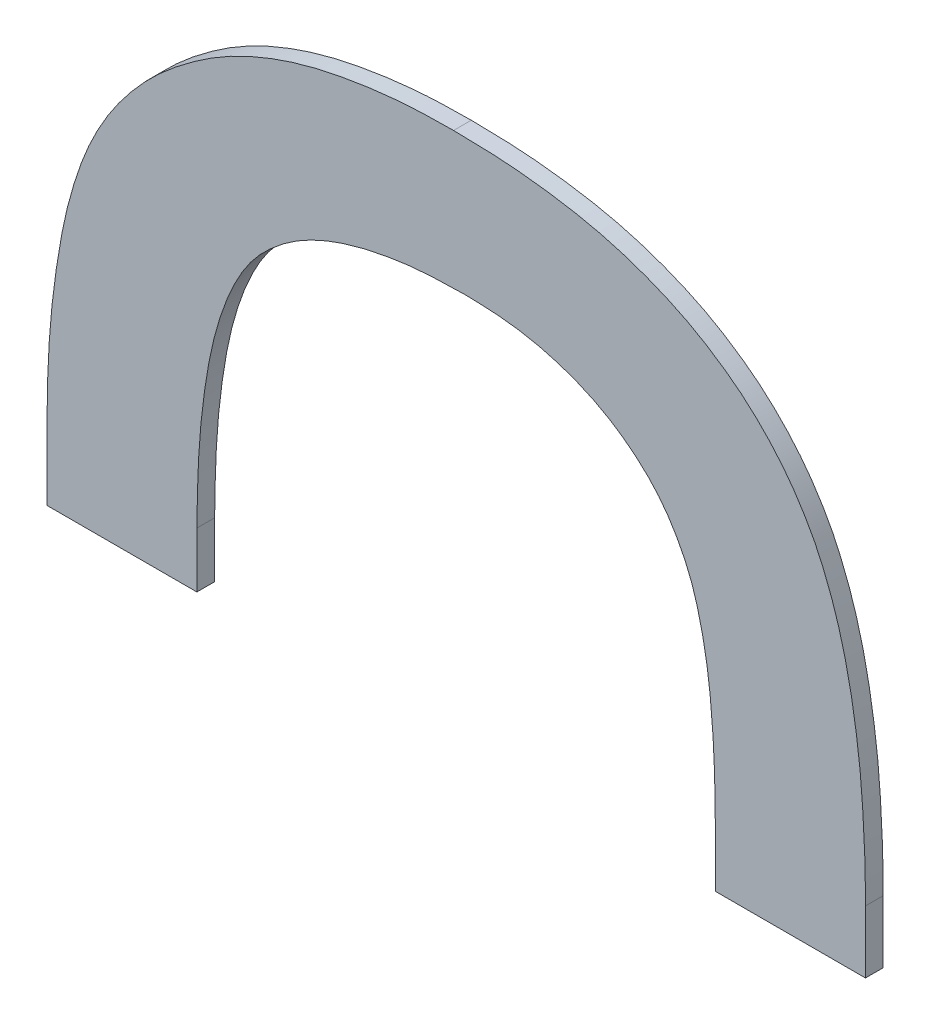
ISO-10303-21;
HEADER;
FILE_DESCRIPTION(('STEP AP214'),'2;1');
FILE_NAME('part.step','',(''),(''),'','','');
FILE_SCHEMA(('AUTOMOTIVE_DESIGN { 1 0 10303 214 1 1 1 1 }'));
ENDSEC;
DATA;
#1=APPLICATION_CONTEXT('core data for automotive mechanical design processes');
#2=APPLICATION_PROTOCOL_DEFINITION('international standard','automotive_design',2000,#1);
#3=PRODUCT_CONTEXT('',#1,'mechanical');
#4=PRODUCT('Part','Part','',(#3));
#5=PRODUCT_RELATED_PRODUCT_CATEGORY('part','',(#4));
#6=PRODUCT_DEFINITION_FORMATION('','',#4);
#7=PRODUCT_DEFINITION_CONTEXT('part definition',#1,'design');
#8=PRODUCT_DEFINITION('design','',#6,#7);
#9=PRODUCT_DEFINITION_SHAPE('','',#8);
#10=(LENGTH_UNIT() NAMED_UNIT(*) SI_UNIT(.MILLI.,.METRE.));
#11=(NAMED_UNIT(*) PLANE_ANGLE_UNIT() SI_UNIT($,.RADIAN.));
#12=(NAMED_UNIT(*) SI_UNIT($,.STERADIAN.) SOLID_ANGLE_UNIT());
#13=UNCERTAINTY_MEASURE_WITH_UNIT(LENGTH_MEASURE(1.E-05),#10,'distance_accuracy_value','');
#14=(GEOMETRIC_REPRESENTATION_CONTEXT(3) GLOBAL_UNCERTAINTY_ASSIGNED_CONTEXT((#13)) GLOBAL_UNIT_ASSIGNED_CONTEXT((#10,
#11,#12)) REPRESENTATION_CONTEXT('',''));
#15=CARTESIAN_POINT('',(0.,0.,0.));
#16=DIRECTION('',(0.,0.,1.));
#17=DIRECTION('',(1.,0.,0.));
#18=AXIS2_PLACEMENT_3D('',#15,#16,#17);
#19=CARTESIAN_POINT('',(-7.30769230769231,2.06129807692308,0.5));
#20=DIRECTION('',(-1.,0.,0.));
#21=DIRECTION('',(0.,0.,1.));
#22=AXIS2_PLACEMENT_3D('',#19,#20,#21);
#23=PLANE('',#22);
#24=DIRECTION('',(0.,-1.,0.));
#25=VECTOR('',#24,1.);
#26=CARTESIAN_POINT('',(-7.30769230769231,2.06129807692308,1.));
#27=LINE('',#26,#25);
#28=CARTESIAN_POINT('',(-7.30769230769231,2.06129807692308,1.));
#29=VERTEX_POINT('',#28);
#30=CARTESIAN_POINT('',(-7.30769230769231,0.5,1.));
#31=VERTEX_POINT('',#30);
#32=EDGE_CURVE('E239',#29,#31,#27,.T.);
#33=ORIENTED_EDGE('',*,*,#32,.T.);
#34=DIRECTION('',(0.,0.,-1.));
#35=VECTOR('',#34,1.);
#36=CARTESIAN_POINT('',(-7.30769230769231,0.5,0.5));
#37=LINE('',#36,#35);
#38=CARTESIAN_POINT('',(-7.30769230769231,0.5,0.500000000000067));
#39=VERTEX_POINT('',#38);
#40=EDGE_CURVE('E74',#31,#39,#37,.T.);
#41=ORIENTED_EDGE('',*,*,#40,.T.);
#42=DIRECTION('',(0.,-1.,0.));
#43=VECTOR('',#42,1.);
#44=CARTESIAN_POINT('',(-7.30769230769231,2.06129807692308,0.5));
#45=LINE('',#44,#43);
#46=CARTESIAN_POINT('',(-7.30769230769231,2.06129807692308,0.5));
#47=VERTEX_POINT('',#46);
#48=EDGE_CURVE('E186',#47,#39,#45,.T.);
#49=ORIENTED_EDGE('',*,*,#48,.F.);
#50=DIRECTION('',(0.,0.,1.));
#51=VECTOR('',#50,1.);
#52=CARTESIAN_POINT('',(-7.30769230769231,2.06129807692308,0.5));
#53=LINE('',#52,#51);
#54=EDGE_CURVE('E215',#47,#29,#53,.T.);
#55=ORIENTED_EDGE('',*,*,#54,.T.);
#56=EDGE_LOOP('',(#33,#41,#49,#55));
#57=FACE_BOUND('',#56,.T.);
#58=ADVANCED_FACE('F39',(#57),#23,.F.);
#59=CARTESIAN_POINT('',(-11.5384615384615,-15.,0.5));
#60=DIRECTION('',(1.,0.,0.));
#61=DIRECTION('',(0.,0.,-1.));
#62=AXIS2_PLACEMENT_3D('',#59,#60,#61);
#63=PLANE('',#62);
#64=DIRECTION('',(0.,1.,0.));
#65=VECTOR('',#64,1.);
#66=CARTESIAN_POINT('',(-11.5384615384615,-15.,0.5));
#67=LINE('',#66,#65);
#68=CARTESIAN_POINT('',(-11.5384615384615,0.5,0.5));
#69=VERTEX_POINT('',#68);
#70=CARTESIAN_POINT('',(-11.5384615384615,2.25961538461538,0.5));
#71=VERTEX_POINT('',#70);
#72=EDGE_CURVE('E118',#69,#71,#67,.T.);
#73=ORIENTED_EDGE('',*,*,#72,.F.);
#74=DIRECTION('',(0.,0.,1.));
#75=VECTOR('',#74,1.);
#76=CARTESIAN_POINT('',(-11.5384615384615,0.5,0.5));
#77=LINE('',#76,#75);
#78=CARTESIAN_POINT('',(-11.5384615384615,0.5,1.));
#79=VERTEX_POINT('',#78);
#80=EDGE_CURVE('E79',#69,#79,#77,.T.);
#81=ORIENTED_EDGE('',*,*,#80,.T.);
#82=DIRECTION('',(0.,1.,0.));
#83=VECTOR('',#82,1.);
#84=CARTESIAN_POINT('',(-11.5384615384615,-15.,1.));
#85=LINE('',#84,#83);
#86=CARTESIAN_POINT('',(-11.5384615384615,2.25961538461538,1.));
#87=VERTEX_POINT('',#86);
#88=EDGE_CURVE('E132',#79,#87,#85,.T.);
#89=ORIENTED_EDGE('',*,*,#88,.T.);
#90=DIRECTION('',(0.,0.,1.));
#91=VECTOR('',#90,1.);
#92=CARTESIAN_POINT('',(-11.5384615384615,2.25961538461538,0.5));
#93=LINE('',#92,#91);
#94=EDGE_CURVE('E131',#71,#87,#93,.T.);
#95=ORIENTED_EDGE('',*,*,#94,.F.);
#96=EDGE_LOOP('',(#73,#81,#89,#95));
#97=FACE_BOUND('',#96,.T.);
#98=ADVANCED_FACE('F135',(#97),#63,.F.);
#99=CARTESIAN_POINT('',(11.5384615384615,2.25961538461538,0.5));
#100=DIRECTION('',(-1.,0.,0.));
#101=DIRECTION('',(0.,0.,1.));
#102=AXIS2_PLACEMENT_3D('',#99,#100,#101);
#103=PLANE('',#102);
#104=DIRECTION('',(0.,-1.,0.));
#105=VECTOR('',#104,1.);
#106=CARTESIAN_POINT('',(11.5384615384615,2.25961538461538,1.));
#107=LINE('',#106,#105);
#108=CARTESIAN_POINT('',(11.5384615384615,2.25961538461538,1.));
#109=VERTEX_POINT('',#108);
#110=CARTESIAN_POINT('',(11.5384615384615,0.5,1.));
#111=VERTEX_POINT('',#110);
#112=EDGE_CURVE('E231',#109,#111,#107,.T.);
#113=ORIENTED_EDGE('',*,*,#112,.T.);
#114=DIRECTION('',(0.,0.,-1.));
#115=VECTOR('',#114,1.);
#116=CARTESIAN_POINT('',(11.5384615384615,0.5,0.5));
#117=LINE('',#116,#115);
#118=CARTESIAN_POINT('',(11.5384615384615,0.5,0.500000000000646));
#119=VERTEX_POINT('',#118);
#120=EDGE_CURVE('E59',#111,#119,#117,.T.);
#121=ORIENTED_EDGE('',*,*,#120,.T.);
#122=DIRECTION('',(0.,-1.,0.));
#123=VECTOR('',#122,1.);
#124=CARTESIAN_POINT('',(11.5384615384615,2.25961538461538,0.5));
#125=LINE('',#124,#123);
#126=CARTESIAN_POINT('',(11.5384615384615,2.25961538461538,0.5));
#127=VERTEX_POINT('',#126);
#128=EDGE_CURVE('E238',#127,#119,#125,.T.);
#129=ORIENTED_EDGE('',*,*,#128,.F.);
#130=DIRECTION('',(0.,0.,1.));
#131=VECTOR('',#130,1.);
#132=CARTESIAN_POINT('',(11.5384615384615,2.25961538461538,0.5));
#133=LINE('',#132,#131);
#134=EDGE_CURVE('E225',#127,#109,#133,.T.);
#135=ORIENTED_EDGE('',*,*,#134,.T.);
#136=EDGE_LOOP('',(#113,#121,#129,#135));
#137=FACE_BOUND('',#136,.T.);
#138=ADVANCED_FACE('F278',(#137),#103,.F.);
#139=CARTESIAN_POINT('',(7.3076923076923,-15.,0.5));
#140=DIRECTION('',(1.,0.,0.));
#141=DIRECTION('',(0.,0.,-1.));
#142=AXIS2_PLACEMENT_3D('',#139,#140,#141);
#143=PLANE('',#142);
#144=DIRECTION('',(0.,1.,0.));
#145=VECTOR('',#144,1.);
#146=CARTESIAN_POINT('',(7.3076923076923,-15.,0.5));
#147=LINE('',#146,#145);
#148=CARTESIAN_POINT('',(7.3076923076923,0.5,0.5));
#149=VERTEX_POINT('',#148);
#150=CARTESIAN_POINT('',(7.3076923076923,2.06129807692308,0.5));
#151=VERTEX_POINT('',#150);
#152=EDGE_CURVE('E43',#149,#151,#147,.T.);
#153=ORIENTED_EDGE('',*,*,#152,.F.);
#154=DIRECTION('',(0.,0.,1.));
#155=VECTOR('',#154,1.);
#156=CARTESIAN_POINT('',(7.3076923076923,0.5,0.5));
#157=LINE('',#156,#155);
#158=CARTESIAN_POINT('',(7.3076923076923,0.5,1.));
#159=VERTEX_POINT('',#158);
#160=EDGE_CURVE('E224',#149,#159,#157,.T.);
#161=ORIENTED_EDGE('',*,*,#160,.T.);
#162=DIRECTION('',(0.,1.,0.));
#163=VECTOR('',#162,1.);
#164=CARTESIAN_POINT('',(7.3076923076923,-15.,1.));
#165=LINE('',#164,#163);
#166=CARTESIAN_POINT('',(7.3076923076923,2.06129807692308,1.));
#167=VERTEX_POINT('',#166);
#168=EDGE_CURVE('E236',#159,#167,#165,.T.);
#169=ORIENTED_EDGE('',*,*,#168,.T.);
#170=DIRECTION('',(0.,0.,1.));
#171=VECTOR('',#170,1.);
#172=CARTESIAN_POINT('',(7.3076923076923,2.06129807692308,0.5));
#173=LINE('',#172,#171);
#174=EDGE_CURVE('E209',#151,#167,#173,.T.);
#175=ORIENTED_EDGE('',*,*,#174,.F.);
#176=EDGE_LOOP('',(#153,#161,#169,#175));
#177=FACE_BOUND('',#176,.T.);
#178=ADVANCED_FACE('F260',(#177),#143,.F.);
#179=CARTESIAN_POINT('',(-9.1279945813475,11.8227943515889,0.5));
#180=DIRECTION('',(0.,0.,1.));
#181=DIRECTION('',(1.,0.,0.));
#182=AXIS2_PLACEMENT_3D('',#179,#180,#181);
#183=PLANE('',#182);
#184=ORIENTED_EDGE('',*,*,#128,.T.);
#185=DIRECTION('',(-1.,0.,0.));
#186=VECTOR('',#185,1.);
#187=CARTESIAN_POINT('',(-9.1279945813475,0.5,0.500000000000011));
#188=LINE('',#187,#186);
#189=EDGE_CURVE('E242',#119,#149,#188,.T.);
#190=ORIENTED_EDGE('',*,*,#189,.T.);
#191=ORIENTED_EDGE('',*,*,#152,.T.);
#192=CARTESIAN_POINT('',(7.3076923076923,2.06129807692308,0.5));
#193=CARTESIAN_POINT('',(7.30492464339925,2.37180951393219,0.5));
#194=CARTESIAN_POINT('',(7.29958439432423,2.97094591152046,0.5));
#195=CARTESIAN_POINT('',(7.27179811611518,3.83886988209014,0.5));
#196=CARTESIAN_POINT('',(7.21599643148024,4.64427080773635,0.5));
#197=CARTESIAN_POINT('',(7.14786609444757,5.38652355137483,0.5));
#198=CARTESIAN_POINT('',(7.05207843159399,6.06454337816855,0.5));
#199=CARTESIAN_POINT('',(6.93166836438434,6.67792351238892,0.5));
#200=CARTESIAN_POINT('',(6.79559411421944,7.23021580945742,0.5));
#201=CARTESIAN_POINT('',(6.59269758736639,7.87663769488416,0.5));
#202=CARTESIAN_POINT('',(6.2509578197552,8.59540790723907,0.5));
#203=CARTESIAN_POINT('',(5.73334589638995,9.37134422120032,0.5));
#204=CARTESIAN_POINT('',(5.06978727576096,10.0229214121841,0.5));
#205=CARTESIAN_POINT('',(4.30096133975564,10.5755701458769,0.5));
#206=CARTESIAN_POINT('',(3.42239283444398,11.0065956953157,0.5));
#207=CARTESIAN_POINT('',(2.44954968934613,11.3203474222732,0.5));
#208=CARTESIAN_POINT('',(1.3834294379006,11.5082326315945,0.5));
#209=CARTESIAN_POINT('',(0.641806032218003,11.5281598729243,0.5));
#210=CARTESIAN_POINT('',(0.258413461538454,11.5384615384615,0.5));
#211=B_SPLINE_CURVE_WITH_KNOTS('',3,(#192,#193,#194,#195,#196,#197,#198,#199,#200,#201,#202,
#203,#204,#205,#206,#207,#208,#209,#210),.UNSPECIFIED.,.F.,.F.,(4,1,1,1,1,1,1,1,1,1,1,1,1,1,1,1,
4),(0.,0.0681523875531097,0.131501036995337,0.190547702737169,0.245319763923776,
0.295061187567315,0.34076006309936,0.382453291313559,0.419855092081938,0.489284591891173,
0.556354865851981,0.623505787770759,0.692196357088421,0.763373155892575,0.837340007597801,
0.915910646622061,1.),.UNSPECIFIED.);
#212=CARTESIAN_POINT('',(0.258413461538454,11.5384615384615,0.5));
#213=VERTEX_POINT('',#212);
#214=EDGE_CURVE('E174',#151,#213,#211,.T.);
#215=ORIENTED_EDGE('',*,*,#214,.T.);
#216=CARTESIAN_POINT('',(0.258413461538454,11.5384615384615,0.5));
#217=CARTESIAN_POINT('',(-0.0702853549810801,11.5328710973775,0.5));
#218=CARTESIAN_POINT('',(-0.70496950329935,11.5220765214318,0.5));
#219=CARTESIAN_POINT('',(-1.62014451690163,11.434868408113,0.5));
#220=CARTESIAN_POINT('',(-2.45921785336281,11.2762568330178,0.5));
#221=CARTESIAN_POINT('',(-3.23061160376175,11.0702542734783,0.5));
#222=CARTESIAN_POINT('',(-3.9281032248337,10.7940283020894,0.5));
#223=CARTESIAN_POINT('',(-4.55670215304996,10.4595153882128,0.5));
#224=CARTESIAN_POINT('',(-5.09978346750444,10.0484527528207,0.5));
#225=CARTESIAN_POINT('',(-5.59117335237757,9.58702031593561,0.5));
#226=CARTESIAN_POINT('',(-6.00613112071804,9.02529527782142,0.5));
#227=CARTESIAN_POINT('',(-6.35288702731768,8.35774571413977,0.5));
#228=CARTESIAN_POINT('',(-6.65193442729842,7.58382060950632,0.5));
#229=CARTESIAN_POINT('',(-6.89682858419583,6.69616380722172,0.5));
#230=CARTESIAN_POINT('',(-7.07567007960251,5.69370283232904,0.5));
#231=CARTESIAN_POINT('',(-7.2153850201337,4.58270417195884,0.5));
#232=CARTESIAN_POINT('',(-7.28866601234068,3.35834252049965,0.5));
#233=CARTESIAN_POINT('',(-7.30116763858732,2.50609227634031,0.5));
#234=CARTESIAN_POINT('',(-7.30769230769231,2.06129807692308,0.5));
#235=B_SPLINE_CURVE_WITH_KNOTS('',3,(#216,#217,#218,#219,#220,#221,#222,#223,#224,#225,#226,
#227,#228,#229,#230,#231,#232,#233,#234),.UNSPECIFIED.,.F.,.F.,(4,1,1,1,1,1,1,1,1,1,1,1,1,1,1,1,
4),(0.,0.0694744696082631,0.134148169561674,0.194025450312316,0.249805570083777,
0.302644235940443,0.352286550022306,0.39979548148293,0.446212546524587,0.494314049923034,
0.546594986641963,0.604782077121389,0.669401695688407,0.740905897606556,0.819843157026125,
0.90597512961801,1.),.UNSPECIFIED.);
#236=EDGE_CURVE('E178',#213,#47,#235,.T.);
#237=ORIENTED_EDGE('',*,*,#236,.T.);
#238=ORIENTED_EDGE('',*,*,#48,.T.);
#239=EDGE_CURVE('E77',#39,#69,#188,.T.);
#240=ORIENTED_EDGE('',*,*,#239,.T.);
#241=ORIENTED_EDGE('',*,*,#72,.T.);
#242=CARTESIAN_POINT('',(-11.5384615384615,2.25961538461538,0.5));
#243=CARTESIAN_POINT('',(-11.5340612526563,2.6262309134687,0.5));
#244=CARTESIAN_POINT('',(-11.5254982892703,3.33966533323989,0.5));
#245=CARTESIAN_POINT('',(-11.4863268967097,4.38016034794047,0.5));
#246=CARTESIAN_POINT('',(-11.4092879584686,5.36272296458241,0.5));
#247=CARTESIAN_POINT('',(-11.2939236254168,6.28432928941146,0.5));
#248=CARTESIAN_POINT('',(-11.1560519585036,7.15068568459334,0.5));
#249=CARTESIAN_POINT('',(-10.9931716516817,7.95886617242391,0.5));
#250=CARTESIAN_POINT('',(-10.7856103519112,8.70815010365485,0.5));
#251=CARTESIAN_POINT('',(-10.552633586817,9.40676242289213,0.5));
#252=CARTESIAN_POINT('',(-10.2752052785402,10.0608586839567,0.5));
#253=CARTESIAN_POINT('',(-9.94714250776757,10.6798210539499,0.5));
#254=CARTESIAN_POINT('',(-9.57009976714921,11.2675364183271,0.5));
#255=CARTESIAN_POINT('',(-9.13982636990601,11.8227112319163,0.5));
#256=CARTESIAN_POINT('',(-8.66316070509604,12.3487173012148,0.5));
#257=CARTESIAN_POINT('',(-8.13449329563663,12.841393988725,0.5));
#258=CARTESIAN_POINT('',(-7.55145160462416,13.2973326288733,0.5));
#259=CARTESIAN_POINT('',(-6.92881865788958,13.7337693981739,0.5));
#260=CARTESIAN_POINT('',(-6.25019786991767,14.1240786478193,0.5));
#261=CARTESIAN_POINT('',(-5.5170829891336,14.4607431999846,0.5));
#262=CARTESIAN_POINT('',(-4.73417797151823,14.750325096289,0.5));
#263=CARTESIAN_POINT('',(-3.89767072007156,14.9831310596466,0.5));
#264=CARTESIAN_POINT('',(-3.01140022661227,15.1610472772252,0.5));
#265=CARTESIAN_POINT('',(-2.07665015904746,15.2940835399966,0.5));
#266=CARTESIAN_POINT('',(-1.09110898318668,15.3727217749308,0.5));
#267=CARTESIAN_POINT('',(-0.416810076717399,15.3805921364478,0.5));
#268=CARTESIAN_POINT('',(-0.0721153846153927,15.3846153846154,0.5));
#269=B_SPLINE_CURVE_WITH_KNOTS('',3,(#242,#243,#244,#245,#246,#247,#248,#249,#250,#251,#252,
#253,#254,#255,#256,#257,#258,#259,#260,#261,#262,#263,#264,#265,#266,#267,#268),.UNSPECIFIED.,
.F.,.F.,(4,1,1,1,1,1,1,1,1,1,1,1,1,1,1,1,1,1,1,1,1,1,1,1,4),(0.,0.0546407144744631,
0.106330919884652,0.155147953952163,0.201472174088549,0.244712501219021,0.285873562670016,
0.324259277154986,0.360512285011698,0.395557726801311,0.4300132653778,0.464794488861085,
0.499488476916475,0.534572046124569,0.570481696802378,0.60703584911766,0.644798886777896,
0.683717265264563,0.723522131295569,0.764893775301427,0.807993711388816,0.852784120674043,
0.899522077845962,0.948636715694403,1.),.UNSPECIFIED.);
#270=CARTESIAN_POINT('',(-0.0721153846153927,15.3846153846154,0.5));
#271=VERTEX_POINT('',#270);
#272=EDGE_CURVE('E124',#71,#271,#269,.T.);
#273=ORIENTED_EDGE('',*,*,#272,.T.);
#274=CARTESIAN_POINT('',(-0.0721153846153927,15.3846153846154,0.5));
#275=CARTESIAN_POINT('',(0.264518715414854,15.3796616598468,0.5));
#276=CARTESIAN_POINT('',(0.920423994624566,15.3700097136324,0.5));
#277=CARTESIAN_POINT('',(1.88158746322403,15.304702510971,0.5));
#278=CARTESIAN_POINT('',(2.79589537908769,15.1890826610173,0.5));
#279=CARTESIAN_POINT('',(3.66596857120517,15.0369883310616,0.5));
#280=CARTESIAN_POINT('',(4.48752186728969,14.8325913341433,0.5));
#281=CARTESIAN_POINT('',(5.25957362054852,14.5782851361573,0.5));
#282=CARTESIAN_POINT('',(5.98715491057017,14.2849682150574,0.5));
#283=CARTESIAN_POINT('',(6.67114975176588,13.9500760195656,0.5));
#284=CARTESIAN_POINT('',(7.30134818837077,13.5604418430828,0.5));
#285=CARTESIAN_POINT('',(7.89398727333909,13.1443205046601,0.5));
#286=CARTESIAN_POINT('',(8.43153559786857,12.6754130025017,0.5));
#287=CARTESIAN_POINT('',(8.92434289384963,12.1713846235726,0.5));
#288=CARTESIAN_POINT('',(9.37314508634097,11.6280927132947,0.5));
#289=CARTESIAN_POINT('',(9.76914848452326,11.0403560048676,0.5));
#290=CARTESIAN_POINT('',(10.1276992503906,10.4166035828515,0.5));
#291=CARTESIAN_POINT('',(10.4252910925288,9.74071549769036,0.5));
#292=CARTESIAN_POINT('',(10.6939683405418,9.01932401356209,0.5));
#293=CARTESIAN_POINT('',(10.9191440367199,8.23726023656803,0.5));
#294=CARTESIAN_POINT('',(11.1114156809584,7.39452327675616,0.5));
#295=CARTESIAN_POINT('',(11.2643522580033,6.48916731646381,0.5));
#296=CARTESIAN_POINT('',(11.3941368723213,5.52154491453743,0.5));
#297=CARTESIAN_POINT('',(11.4714173329536,4.48812954314935,0.5));
#298=CARTESIAN_POINT('',(11.5294909767043,3.39408832000542,0.5));
#299=CARTESIAN_POINT('',(11.5354195967522,2.6443182197005,0.5));
#300=CARTESIAN_POINT('',(11.5384615384615,2.25961538461538,0.5));
#301=B_SPLINE_CURVE_WITH_KNOTS('',3,(#274,#275,#276,#277,#278,#279,#280,#281,#282,#283,#284,
#285,#286,#287,#288,#289,#290,#291,#292,#293,#294,#295,#296,#297,#298,#299,#300),.UNSPECIFIED.,
.F.,.F.,(4,1,1,1,1,1,1,1,1,1,1,1,1,1,1,1,1,1,1,1,1,1,1,1,4),(0.,0.0497116207271324,
0.0968592144113372,0.142173574931603,0.185751389824472,0.227220904620069,0.267071972318326,
0.305689623622102,0.342996802804478,0.379372877500813,0.414999075056876,0.449812797537921,
0.484538431658974,0.519006067109921,0.553712796066273,0.589083852803694,0.625097269819054,
0.662628953579155,0.702694640878255,0.745177332626792,0.790211777884763,0.838242017597077,
0.88929109798676,0.943195883036236,1.),.UNSPECIFIED.);
#302=EDGE_CURVE('E143',#271,#127,#301,.T.);
#303=ORIENTED_EDGE('',*,*,#302,.T.);
#304=EDGE_LOOP('',(#184,#190,#191,#215,#237,#238,#240,#241,#273,#303));
#305=FACE_BOUND('',#304,.T.);
#306=ADVANCED_FACE('F121',(#305),#183,.F.);
#307=CARTESIAN_POINT('',(-9.1279945813475,11.8227943515889,1.));
#308=DIRECTION('',(0.,0.,1.));
#309=DIRECTION('',(1.,0.,0.));
#310=AXIS2_PLACEMENT_3D('',#307,#308,#309);
#311=PLANE('',#310);
#312=ORIENTED_EDGE('',*,*,#88,.F.);
#313=DIRECTION('',(1.,0.,0.));
#314=VECTOR('',#313,1.);
#315=CARTESIAN_POINT('',(-17.,0.5,1.));
#316=LINE('',#315,#314);
#317=EDGE_CURVE('E147',#79,#31,#316,.T.);
#318=ORIENTED_EDGE('',*,*,#317,.T.);
#319=ORIENTED_EDGE('',*,*,#32,.F.);
#320=CARTESIAN_POINT('',(0.258413461538454,11.5384615384615,1.));
#321=CARTESIAN_POINT('',(-0.0702853549810801,11.5328710973775,1.));
#322=CARTESIAN_POINT('',(-0.70496950329935,11.5220765214318,1.));
#323=CARTESIAN_POINT('',(-1.62014451690163,11.434868408113,1.));
#324=CARTESIAN_POINT('',(-2.45921785336281,11.2762568330178,1.));
#325=CARTESIAN_POINT('',(-3.23061160376175,11.0702542734783,1.));
#326=CARTESIAN_POINT('',(-3.9281032248337,10.7940283020894,1.));
#327=CARTESIAN_POINT('',(-4.55670215304996,10.4595153882128,1.));
#328=CARTESIAN_POINT('',(-5.09978346750444,10.0484527528207,1.));
#329=CARTESIAN_POINT('',(-5.59117335237757,9.58702031593561,1.));
#330=CARTESIAN_POINT('',(-6.00613112071804,9.02529527782142,1.));
#331=CARTESIAN_POINT('',(-6.35288702731768,8.35774571413977,1.));
#332=CARTESIAN_POINT('',(-6.65193442729842,7.58382060950632,1.));
#333=CARTESIAN_POINT('',(-6.89682858419583,6.69616380722172,1.));
#334=CARTESIAN_POINT('',(-7.07567007960251,5.69370283232904,1.));
#335=CARTESIAN_POINT('',(-7.2153850201337,4.58270417195884,1.));
#336=CARTESIAN_POINT('',(-7.28866601234068,3.35834252049965,1.));
#337=CARTESIAN_POINT('',(-7.30116763858732,2.50609227634031,1.));
#338=CARTESIAN_POINT('',(-7.30769230769231,2.06129807692308,1.));
#339=B_SPLINE_CURVE_WITH_KNOTS('',3,(#320,#321,#322,#323,#324,#325,#326,#327,#328,#329,#330,
#331,#332,#333,#334,#335,#336,#337,#338),.UNSPECIFIED.,.F.,.F.,(4,1,1,1,1,1,1,1,1,1,1,1,1,1,1,1,
4),(0.,0.0694744696082631,0.134148169561674,0.194025450312316,0.249805570083777,
0.302644235940443,0.352286550022306,0.39979548148293,0.446212546524587,0.494314049923034,
0.546594986641963,0.604782077121389,0.669401695688407,0.740905897606556,0.819843157026125,
0.90597512961801,1.),.UNSPECIFIED.);
#340=CARTESIAN_POINT('',(0.258413461538454,11.5384615384615,1.));
#341=VERTEX_POINT('',#340);
#342=EDGE_CURVE('E47',#341,#29,#339,.T.);
#343=ORIENTED_EDGE('',*,*,#342,.F.);
#344=CARTESIAN_POINT('',(7.3076923076923,2.06129807692308,1.));
#345=CARTESIAN_POINT('',(7.30492464339925,2.37180951393219,1.));
#346=CARTESIAN_POINT('',(7.29958439432423,2.97094591152046,1.));
#347=CARTESIAN_POINT('',(7.27179811611518,3.83886988209014,1.));
#348=CARTESIAN_POINT('',(7.21599643148024,4.64427080773635,1.));
#349=CARTESIAN_POINT('',(7.14786609444757,5.38652355137483,1.));
#350=CARTESIAN_POINT('',(7.05207843159399,6.06454337816855,1.));
#351=CARTESIAN_POINT('',(6.93166836438434,6.67792351238892,1.));
#352=CARTESIAN_POINT('',(6.79559411421944,7.23021580945742,1.));
#353=CARTESIAN_POINT('',(6.59269758736639,7.87663769488416,1.));
#354=CARTESIAN_POINT('',(6.2509578197552,8.59540790723907,1.));
#355=CARTESIAN_POINT('',(5.73334589638995,9.37134422120032,1.));
#356=CARTESIAN_POINT('',(5.06978727576096,10.0229214121841,1.));
#357=CARTESIAN_POINT('',(4.30096133975564,10.5755701458769,1.));
#358=CARTESIAN_POINT('',(3.42239283444398,11.0065956953157,1.));
#359=CARTESIAN_POINT('',(2.44954968934613,11.3203474222732,1.));
#360=CARTESIAN_POINT('',(1.3834294379006,11.5082326315945,1.));
#361=CARTESIAN_POINT('',(0.641806032218003,11.5281598729243,1.));
#362=CARTESIAN_POINT('',(0.258413461538454,11.5384615384615,1.));
#363=B_SPLINE_CURVE_WITH_KNOTS('',3,(#344,#345,#346,#347,#348,#349,#350,#351,#352,#353,#354,
#355,#356,#357,#358,#359,#360,#361,#362),.UNSPECIFIED.,.F.,.F.,(4,1,1,1,1,1,1,1,1,1,1,1,1,1,1,1,
4),(0.,0.0681523875531097,0.131501036995337,0.190547702737169,0.245319763923776,
0.295061187567315,0.34076006309936,0.382453291313559,0.419855092081938,0.489284591891173,
0.556354865851981,0.623505787770759,0.692196357088421,0.763373155892575,0.837340007597801,
0.915910646622061,1.),.UNSPECIFIED.);
#364=EDGE_CURVE('E198',#167,#341,#363,.T.);
#365=ORIENTED_EDGE('',*,*,#364,.F.);
#366=ORIENTED_EDGE('',*,*,#168,.F.);
#367=EDGE_CURVE('E194',#159,#111,#316,.T.);
#368=ORIENTED_EDGE('',*,*,#367,.T.);
#369=ORIENTED_EDGE('',*,*,#112,.F.);
#370=CARTESIAN_POINT('',(-0.0721153846153927,15.3846153846154,1.));
#371=CARTESIAN_POINT('',(0.264518715414854,15.3796616598468,1.));
#372=CARTESIAN_POINT('',(0.920423994624566,15.3700097136324,1.));
#373=CARTESIAN_POINT('',(1.88158746322403,15.304702510971,1.));
#374=CARTESIAN_POINT('',(2.79589537908769,15.1890826610173,1.));
#375=CARTESIAN_POINT('',(3.66596857120517,15.0369883310616,1.));
#376=CARTESIAN_POINT('',(4.48752186728969,14.8325913341433,1.));
#377=CARTESIAN_POINT('',(5.25957362054852,14.5782851361573,1.));
#378=CARTESIAN_POINT('',(5.98715491057017,14.2849682150574,1.));
#379=CARTESIAN_POINT('',(6.67114975176588,13.9500760195656,1.));
#380=CARTESIAN_POINT('',(7.30134818837077,13.5604418430828,1.));
#381=CARTESIAN_POINT('',(7.89398727333909,13.1443205046601,1.));
#382=CARTESIAN_POINT('',(8.43153559786857,12.6754130025017,1.));
#383=CARTESIAN_POINT('',(8.92434289384963,12.1713846235726,1.));
#384=CARTESIAN_POINT('',(9.37314508634097,11.6280927132947,1.));
#385=CARTESIAN_POINT('',(9.76914848452326,11.0403560048676,1.));
#386=CARTESIAN_POINT('',(10.1276992503906,10.4166035828515,1.));
#387=CARTESIAN_POINT('',(10.4252910925288,9.74071549769036,1.));
#388=CARTESIAN_POINT('',(10.6939683405418,9.01932401356209,1.));
#389=CARTESIAN_POINT('',(10.9191440367199,8.23726023656803,1.));
#390=CARTESIAN_POINT('',(11.1114156809584,7.39452327675616,1.));
#391=CARTESIAN_POINT('',(11.2643522580033,6.48916731646381,1.));
#392=CARTESIAN_POINT('',(11.3941368723213,5.52154491453743,1.));
#393=CARTESIAN_POINT('',(11.4714173329536,4.48812954314935,1.));
#394=CARTESIAN_POINT('',(11.5294909767043,3.39408832000542,1.));
#395=CARTESIAN_POINT('',(11.5354195967522,2.6443182197005,1.));
#396=CARTESIAN_POINT('',(11.5384615384615,2.25961538461538,1.));
#397=B_SPLINE_CURVE_WITH_KNOTS('',3,(#370,#371,#372,#373,#374,#375,#376,#377,#378,#379,#380,
#381,#382,#383,#384,#385,#386,#387,#388,#389,#390,#391,#392,#393,#394,#395,#396),.UNSPECIFIED.,
.F.,.F.,(4,1,1,1,1,1,1,1,1,1,1,1,1,1,1,1,1,1,1,1,1,1,1,1,4),(0.,0.0497116207271324,
0.0968592144113372,0.142173574931603,0.185751389824472,0.227220904620069,0.267071972318326,
0.305689623622102,0.342996802804478,0.379372877500813,0.414999075056876,0.449812797537921,
0.484538431658974,0.519006067109921,0.553712796066273,0.589083852803694,0.625097269819054,
0.662628953579155,0.702694640878255,0.745177332626792,0.790211777884763,0.838242017597077,
0.88929109798676,0.943195883036236,1.),.UNSPECIFIED.);
#398=CARTESIAN_POINT('',(-0.0721153846153927,15.3846153846154,1.));
#399=VERTEX_POINT('',#398);
#400=EDGE_CURVE('E140',#399,#109,#397,.T.);
#401=ORIENTED_EDGE('',*,*,#400,.F.);
#402=CARTESIAN_POINT('',(-11.5384615384615,2.25961538461538,1.));
#403=CARTESIAN_POINT('',(-11.5340612526563,2.6262309134687,1.));
#404=CARTESIAN_POINT('',(-11.5254982892703,3.33966533323989,1.));
#405=CARTESIAN_POINT('',(-11.4863268967097,4.38016034794047,1.));
#406=CARTESIAN_POINT('',(-11.4092879584686,5.36272296458241,1.));
#407=CARTESIAN_POINT('',(-11.2939236254168,6.28432928941146,1.));
#408=CARTESIAN_POINT('',(-11.1560519585036,7.15068568459334,1.));
#409=CARTESIAN_POINT('',(-10.9931716516817,7.95886617242391,1.));
#410=CARTESIAN_POINT('',(-10.7856103519112,8.70815010365485,1.));
#411=CARTESIAN_POINT('',(-10.552633586817,9.40676242289213,1.));
#412=CARTESIAN_POINT('',(-10.2752052785402,10.0608586839567,1.));
#413=CARTESIAN_POINT('',(-9.94714250776757,10.6798210539499,1.));
#414=CARTESIAN_POINT('',(-9.57009976714921,11.2675364183271,1.));
#415=CARTESIAN_POINT('',(-9.13982636990601,11.8227112319163,1.));
#416=CARTESIAN_POINT('',(-8.66316070509604,12.3487173012148,1.));
#417=CARTESIAN_POINT('',(-8.13449329563663,12.841393988725,1.));
#418=CARTESIAN_POINT('',(-7.55145160462416,13.2973326288733,1.));
#419=CARTESIAN_POINT('',(-6.92881865788958,13.7337693981739,1.));
#420=CARTESIAN_POINT('',(-6.25019786991767,14.1240786478193,1.));
#421=CARTESIAN_POINT('',(-5.5170829891336,14.4607431999846,1.));
#422=CARTESIAN_POINT('',(-4.73417797151823,14.750325096289,1.));
#423=CARTESIAN_POINT('',(-3.89767072007156,14.9831310596466,1.));
#424=CARTESIAN_POINT('',(-3.01140022661227,15.1610472772252,1.));
#425=CARTESIAN_POINT('',(-2.07665015904746,15.2940835399966,1.));
#426=CARTESIAN_POINT('',(-1.09110898318668,15.3727217749308,1.));
#427=CARTESIAN_POINT('',(-0.416810076717399,15.3805921364478,1.));
#428=CARTESIAN_POINT('',(-0.0721153846153927,15.3846153846154,1.));
#429=B_SPLINE_CURVE_WITH_KNOTS('',3,(#402,#403,#404,#405,#406,#407,#408,#409,#410,#411,#412,
#413,#414,#415,#416,#417,#418,#419,#420,#421,#422,#423,#424,#425,#426,#427,#428),.UNSPECIFIED.,
.F.,.F.,(4,1,1,1,1,1,1,1,1,1,1,1,1,1,1,1,1,1,1,1,1,1,1,1,4),(0.,0.0546407144744631,
0.106330919884652,0.155147953952163,0.201472174088549,0.244712501219021,0.285873562670016,
0.324259277154986,0.360512285011698,0.395557726801311,0.4300132653778,0.464794488861085,
0.499488476916475,0.534572046124569,0.570481696802378,0.60703584911766,0.644798886777896,
0.683717265264563,0.723522131295569,0.764893775301427,0.807993711388816,0.852784120674043,
0.899522077845962,0.948636715694403,1.),.UNSPECIFIED.);
#430=EDGE_CURVE('E138',#87,#399,#429,.T.);
#431=ORIENTED_EDGE('',*,*,#430,.F.);
#432=EDGE_LOOP('',(#312,#318,#319,#343,#365,#366,#368,#369,#401,#431));
#433=FACE_BOUND('',#432,.T.);
#434=ADVANCED_FACE('F41',(#433),#311,.T.);
#435=DIRECTION('',(0.,0.,1.));
#436=VECTOR('',#435,1.);
#437=SURFACE_OF_LINEAR_EXTRUSION('',#269,#436);
#438=ORIENTED_EDGE('',*,*,#430,.T.);
#439=DIRECTION('',(0.,0.,1.));
#440=VECTOR('',#439,1.);
#441=CARTESIAN_POINT('',(-0.0721153846153927,15.3846153846154,0.5));
#442=LINE('',#441,#440);
#443=EDGE_CURVE('E145',#271,#399,#442,.T.);
#444=ORIENTED_EDGE('',*,*,#443,.F.);
#445=ORIENTED_EDGE('',*,*,#272,.F.);
#446=ORIENTED_EDGE('',*,*,#94,.T.);
#447=EDGE_LOOP('',(#438,#444,#445,#446));
#448=FACE_BOUND('',#447,.T.);
#449=ADVANCED_FACE('F139',(#448),#437,.F.);
#450=DIRECTION('',(0.,0.,1.));
#451=VECTOR('',#450,1.);
#452=SURFACE_OF_LINEAR_EXTRUSION('',#301,#451);
#453=ORIENTED_EDGE('',*,*,#400,.T.);
#454=ORIENTED_EDGE('',*,*,#134,.F.);
#455=ORIENTED_EDGE('',*,*,#302,.F.);
#456=ORIENTED_EDGE('',*,*,#443,.T.);
#457=EDGE_LOOP('',(#453,#454,#455,#456));
#458=FACE_BOUND('',#457,.T.);
#459=ADVANCED_FACE('F165',(#458),#452,.F.);
#460=DIRECTION('',(0.,0.,1.));
#461=VECTOR('',#460,1.);
#462=SURFACE_OF_LINEAR_EXTRUSION('',#211,#461);
#463=ORIENTED_EDGE('',*,*,#364,.T.);
#464=DIRECTION('',(0.,0.,1.));
#465=VECTOR('',#464,1.);
#466=CARTESIAN_POINT('',(0.258413461538454,11.5384615384615,0.5));
#467=LINE('',#466,#465);
#468=EDGE_CURVE('E11',#213,#341,#467,.T.);
#469=ORIENTED_EDGE('',*,*,#468,.F.);
#470=ORIENTED_EDGE('',*,*,#214,.F.);
#471=ORIENTED_EDGE('',*,*,#174,.T.);
#472=EDGE_LOOP('',(#463,#469,#470,#471));
#473=FACE_BOUND('',#472,.T.);
#474=ADVANCED_FACE('F168',(#473),#462,.F.);
#475=DIRECTION('',(0.,0.,1.));
#476=VECTOR('',#475,1.);
#477=SURFACE_OF_LINEAR_EXTRUSION('',#235,#476);
#478=ORIENTED_EDGE('',*,*,#342,.T.);
#479=ORIENTED_EDGE('',*,*,#54,.F.);
#480=ORIENTED_EDGE('',*,*,#236,.F.);
#481=ORIENTED_EDGE('',*,*,#468,.T.);
#482=EDGE_LOOP('',(#478,#479,#480,#481));
#483=FACE_BOUND('',#482,.T.);
#484=ADVANCED_FACE('F169',(#483),#477,.F.);
#485=CARTESIAN_POINT('',(-17.,0.5,1.));
#486=DIRECTION('',(0.,1.,0.));
#487=DIRECTION('',(0.,0.,1.));
#488=AXIS2_PLACEMENT_3D('',#485,#486,#487);
#489=PLANE('',#488);
#490=ORIENTED_EDGE('',*,*,#317,.F.);
#491=ORIENTED_EDGE('',*,*,#80,.F.);
#492=ORIENTED_EDGE('',*,*,#239,.F.);
#493=ORIENTED_EDGE('',*,*,#40,.F.);
#494=EDGE_LOOP('',(#490,#491,#492,#493));
#495=FACE_BOUND('',#494,.T.);
#496=ADVANCED_FACE('F270',(#495),#489,.F.);
#497=ORIENTED_EDGE('',*,*,#367,.F.);
#498=ORIENTED_EDGE('',*,*,#160,.F.);
#499=ORIENTED_EDGE('',*,*,#189,.F.);
#500=ORIENTED_EDGE('',*,*,#120,.F.);
#501=EDGE_LOOP('',(#497,#498,#499,#500));
#502=FACE_BOUND('',#501,.T.);
#503=ADVANCED_FACE('F275',(#502),#489,.F.);
#504=CLOSED_SHELL('',(#58,#98,#138,#178,#306,#434,#449,#459,#474,#484,#496,#503));
#505=MANIFOLD_SOLID_BREP('B2',#504);
#506=ADVANCED_BREP_SHAPE_REPRESENTATION('',(#18,#505),#14);
#507=SHAPE_DEFINITION_REPRESENTATION(#9,#506);
ENDSEC;
END-ISO-10303-21;
